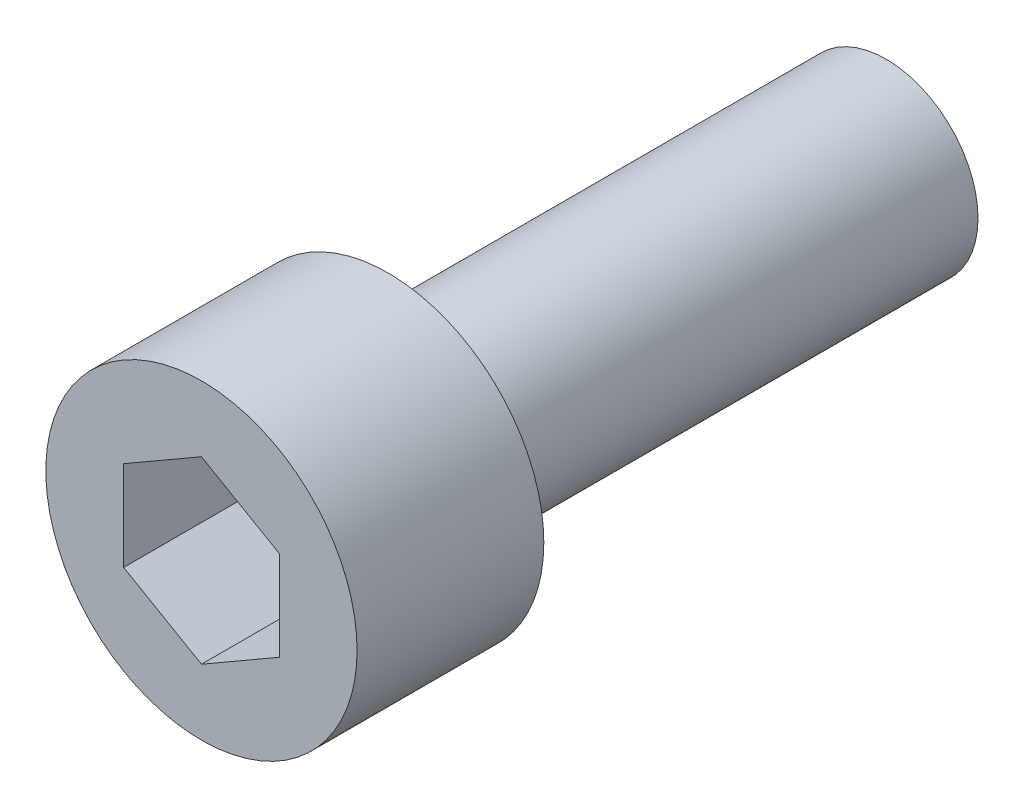
ISO-10303-21;
HEADER;
FILE_DESCRIPTION(('STEP AP214'),'2;1');
FILE_NAME('part.step','',(''),(''),'','','');
FILE_SCHEMA(('AUTOMOTIVE_DESIGN { 1 0 10303 214 1 1 1 1 }'));
ENDSEC;
DATA;
#1=APPLICATION_CONTEXT('core data for automotive mechanical design processes');
#2=APPLICATION_PROTOCOL_DEFINITION('international standard','automotive_design',2000,#1);
#3=PRODUCT_CONTEXT('',#1,'mechanical');
#4=PRODUCT('Part','Part','',(#3));
#5=PRODUCT_RELATED_PRODUCT_CATEGORY('part','',(#4));
#6=PRODUCT_DEFINITION_FORMATION('','',#4);
#7=PRODUCT_DEFINITION_CONTEXT('part definition',#1,'design');
#8=PRODUCT_DEFINITION('design','',#6,#7);
#9=PRODUCT_DEFINITION_SHAPE('','',#8);
#10=(LENGTH_UNIT() NAMED_UNIT(*) SI_UNIT(.MILLI.,.METRE.));
#11=(NAMED_UNIT(*) PLANE_ANGLE_UNIT() SI_UNIT($,.RADIAN.));
#12=(NAMED_UNIT(*) SI_UNIT($,.STERADIAN.) SOLID_ANGLE_UNIT());
#13=UNCERTAINTY_MEASURE_WITH_UNIT(LENGTH_MEASURE(1.E-05),#10,'distance_accuracy_value','');
#14=(GEOMETRIC_REPRESENTATION_CONTEXT(3) GLOBAL_UNCERTAINTY_ASSIGNED_CONTEXT((#13)) GLOBAL_UNIT_ASSIGNED_CONTEXT((#10,
#11,#12)) REPRESENTATION_CONTEXT('',''));
#15=CARTESIAN_POINT('',(0.,0.,0.));
#16=DIRECTION('',(0.,0.,1.));
#17=DIRECTION('',(1.,0.,0.));
#18=AXIS2_PLACEMENT_3D('',#15,#16,#17);
#19=CARTESIAN_POINT('',(0.,0.,-16.));
#20=DIRECTION('',(0.,0.,1.));
#21=DIRECTION('',(1.,0.,0.));
#22=AXIS2_PLACEMENT_3D('',#19,#20,#21);
#23=CYLINDRICAL_SURFACE('',#22,2.95);
#24=CARTESIAN_POINT('',(0.,0.,-16.));
#25=DIRECTION('',(0.,0.,1.));
#26=DIRECTION('',(1.,0.,0.));
#27=AXIS2_PLACEMENT_3D('',#24,#25,#26);
#28=CIRCLE('',#27,2.95);
#29=CARTESIAN_POINT('',(2.95,0.,-16.));
#30=VERTEX_POINT('',#29);
#31=EDGE_CURVE('E11',#30,#30,#28,.T.);
#32=ORIENTED_EDGE('',*,*,#31,.T.);
#33=EDGE_LOOP('',(#32));
#34=FACE_BOUND('',#33,.T.);
#35=CARTESIAN_POINT('',(0.,0.,0.));
#36=DIRECTION('',(0.,0.,1.));
#37=DIRECTION('',(1.,0.,0.));
#38=AXIS2_PLACEMENT_3D('',#35,#36,#37);
#39=CIRCLE('',#38,2.95);
#40=CARTESIAN_POINT('',(2.95,0.,0.));
#41=VERTEX_POINT('',#40);
#42=EDGE_CURVE('E44',#41,#41,#39,.T.);
#43=ORIENTED_EDGE('',*,*,#42,.F.);
#44=EDGE_LOOP('',(#43));
#45=FACE_BOUND('',#44,.T.);
#46=ADVANCED_FACE('F41',(#34,#45),#23,.T.);
#47=CARTESIAN_POINT('',(0.,0.,-16.));
#48=DIRECTION('',(0.,0.,1.));
#49=DIRECTION('',(1.,0.,0.));
#50=AXIS2_PLACEMENT_3D('',#47,#48,#49);
#51=PLANE('',#50);
#52=ORIENTED_EDGE('',*,*,#31,.F.);
#53=EDGE_LOOP('',(#52));
#54=FACE_BOUND('',#53,.T.);
#55=ADVANCED_FACE('F174',(#54),#51,.F.);
#56=CARTESIAN_POINT('',(0.,0.,6.));
#57=DIRECTION('',(0.,0.,-1.));
#58=DIRECTION('',(-1.,0.,0.));
#59=AXIS2_PLACEMENT_3D('',#56,#57,#58);
#60=CYLINDRICAL_SURFACE('',#59,5.);
#61=CARTESIAN_POINT('',(0.,0.,6.));
#62=DIRECTION('',(0.,0.,1.));
#63=DIRECTION('',(1.,0.,0.));
#64=AXIS2_PLACEMENT_3D('',#61,#62,#63);
#65=CIRCLE('',#64,5.);
#66=CARTESIAN_POINT('',(5.,0.,6.));
#67=VERTEX_POINT('',#66);
#68=EDGE_CURVE('E148',#67,#67,#65,.T.);
#69=ORIENTED_EDGE('',*,*,#68,.F.);
#70=EDGE_LOOP('',(#69));
#71=FACE_BOUND('',#70,.T.);
#72=CARTESIAN_POINT('',(0.,0.,0.));
#73=DIRECTION('',(0.,0.,1.));
#74=DIRECTION('',(1.,0.,0.));
#75=AXIS2_PLACEMENT_3D('',#72,#73,#74);
#76=CIRCLE('',#75,5.);
#77=CARTESIAN_POINT('',(5.,0.,0.));
#78=VERTEX_POINT('',#77);
#79=EDGE_CURVE('E142',#78,#78,#76,.T.);
#80=ORIENTED_EDGE('',*,*,#79,.T.);
#81=EDGE_LOOP('',(#80));
#82=FACE_BOUND('',#81,.T.);
#83=ADVANCED_FACE('F154',(#71,#82),#60,.T.);
#84=CARTESIAN_POINT('',(0.,0.,6.));
#85=DIRECTION('',(0.,0.,1.));
#86=DIRECTION('',(1.,0.,0.));
#87=AXIS2_PLACEMENT_3D('',#84,#85,#86);
#88=PLANE('',#87);
#89=DIRECTION('',(0.,1.,0.));
#90=VECTOR('',#89,1.);
#91=CARTESIAN_POINT('',(2.5,-1.44337567297406,6.));
#92=LINE('',#91,#90);
#93=CARTESIAN_POINT('',(2.5,-1.44337567297406,6.));
#94=VERTEX_POINT('',#93);
#95=CARTESIAN_POINT('',(2.5,1.44337567297406,6.));
#96=VERTEX_POINT('',#95);
#97=EDGE_CURVE('E55',#94,#96,#92,.T.);
#98=ORIENTED_EDGE('',*,*,#97,.F.);
#99=DIRECTION('',(0.866025403784438,0.5,0.));
#100=VECTOR('',#99,1.);
#101=CARTESIAN_POINT('',(0.,-2.88675134594813,6.));
#102=LINE('',#101,#100);
#103=CARTESIAN_POINT('',(0.,-2.88675134594813,6.));
#104=VERTEX_POINT('',#103);
#105=EDGE_CURVE('E138',#104,#94,#102,.T.);
#106=ORIENTED_EDGE('',*,*,#105,.F.);
#107=DIRECTION('',(0.866025403784438,-0.5,0.));
#108=VECTOR('',#107,1.);
#109=CARTESIAN_POINT('',(-2.5,-1.44337567297406,6.));
#110=LINE('',#109,#108);
#111=CARTESIAN_POINT('',(-2.5,-1.44337567297406,6.));
#112=VERTEX_POINT('',#111);
#113=EDGE_CURVE('E136',#112,#104,#110,.T.);
#114=ORIENTED_EDGE('',*,*,#113,.F.);
#115=DIRECTION('',(0.,-1.,0.));
#116=VECTOR('',#115,1.);
#117=CARTESIAN_POINT('',(-2.5,1.44337567297407,6.));
#118=LINE('',#117,#116);
#119=CARTESIAN_POINT('',(-2.5,1.44337567297407,6.));
#120=VERTEX_POINT('',#119);
#121=EDGE_CURVE('E103',#120,#112,#118,.T.);
#122=ORIENTED_EDGE('',*,*,#121,.F.);
#123=DIRECTION('',(-0.866025403784439,-0.5,0.));
#124=VECTOR('',#123,1.);
#125=CARTESIAN_POINT('',(0.,2.88675134594813,6.));
#126=LINE('',#125,#124);
#127=CARTESIAN_POINT('',(0.,2.88675134594813,6.));
#128=VERTEX_POINT('',#127);
#129=EDGE_CURVE('E132',#128,#120,#126,.T.);
#130=ORIENTED_EDGE('',*,*,#129,.F.);
#131=DIRECTION('',(-0.866025403784439,0.5,0.));
#132=VECTOR('',#131,1.);
#133=CARTESIAN_POINT('',(2.5,1.44337567297406,6.));
#134=LINE('',#133,#132);
#135=EDGE_CURVE('E129',#96,#128,#134,.T.);
#136=ORIENTED_EDGE('',*,*,#135,.F.);
#137=EDGE_LOOP('',(#98,#106,#114,#122,#130,#136));
#138=FACE_BOUND('',#137,.T.);
#139=ORIENTED_EDGE('',*,*,#68,.T.);
#140=EDGE_LOOP('',(#139));
#141=FACE_BOUND('',#140,.T.);
#142=ADVANCED_FACE('F159',(#138,#141),#88,.T.);
#143=CARTESIAN_POINT('',(0.,0.,0.));
#144=DIRECTION('',(0.,0.,1.));
#145=DIRECTION('',(1.,0.,0.));
#146=AXIS2_PLACEMENT_3D('',#143,#144,#145);
#147=PLANE('',#146);
#148=ORIENTED_EDGE('',*,*,#42,.T.);
#149=EDGE_LOOP('',(#148));
#150=FACE_BOUND('',#149,.T.);
#151=ORIENTED_EDGE('',*,*,#79,.F.);
#152=EDGE_LOOP('',(#151));
#153=FACE_BOUND('',#152,.T.);
#154=ADVANCED_FACE('F156',(#150,#153),#147,.F.);
#155=CARTESIAN_POINT('',(2.5,-1.44337567297406,2.1));
#156=DIRECTION('',(1.,0.,0.));
#157=DIRECTION('',(0.,1.,0.));
#158=AXIS2_PLACEMENT_3D('',#155,#156,#157);
#159=PLANE('',#158);
#160=ORIENTED_EDGE('',*,*,#97,.T.);
#161=DIRECTION('',(0.,0.,1.));
#162=VECTOR('',#161,1.);
#163=CARTESIAN_POINT('',(2.5,1.44337567297406,2.1));
#164=LINE('',#163,#162);
#165=CARTESIAN_POINT('',(2.5,1.44337567297406,2.1));
#166=VERTEX_POINT('',#165);
#167=EDGE_CURVE('E85',#166,#96,#164,.T.);
#168=ORIENTED_EDGE('',*,*,#167,.F.);
#169=DIRECTION('',(0.,1.,0.));
#170=VECTOR('',#169,1.);
#171=CARTESIAN_POINT('',(2.5,-1.44337567297406,2.1));
#172=LINE('',#171,#170);
#173=CARTESIAN_POINT('',(2.5,-1.44337567297406,2.1));
#174=VERTEX_POINT('',#173);
#175=EDGE_CURVE('E140',#174,#166,#172,.T.);
#176=ORIENTED_EDGE('',*,*,#175,.F.);
#177=DIRECTION('',(0.,0.,1.));
#178=VECTOR('',#177,1.);
#179=CARTESIAN_POINT('',(2.5,-1.44337567297406,2.1));
#180=LINE('',#179,#178);
#181=EDGE_CURVE('E63',#174,#94,#180,.T.);
#182=ORIENTED_EDGE('',*,*,#181,.T.);
#183=EDGE_LOOP('',(#160,#168,#176,#182));
#184=FACE_BOUND('',#183,.T.);
#185=ADVANCED_FACE('F158',(#184),#159,.F.);
#186=CARTESIAN_POINT('',(0.,-2.88675134594813,2.1));
#187=DIRECTION('',(0.5,-0.866025403784438,0.));
#188=DIRECTION('',(0.866025403784439,0.5,0.));
#189=AXIS2_PLACEMENT_3D('',#186,#187,#188);
#190=PLANE('',#189);
#191=ORIENTED_EDGE('',*,*,#105,.T.);
#192=ORIENTED_EDGE('',*,*,#181,.F.);
#193=DIRECTION('',(0.866025403784438,0.5,0.));
#194=VECTOR('',#193,1.);
#195=CARTESIAN_POINT('',(0.,-2.88675134594813,2.1));
#196=LINE('',#195,#194);
#197=CARTESIAN_POINT('',(0.,-2.88675134594813,2.1));
#198=VERTEX_POINT('',#197);
#199=EDGE_CURVE('E115',#198,#174,#196,.T.);
#200=ORIENTED_EDGE('',*,*,#199,.F.);
#201=DIRECTION('',(0.,0.,1.));
#202=VECTOR('',#201,1.);
#203=CARTESIAN_POINT('',(0.,-2.88675134594813,2.1));
#204=LINE('',#203,#202);
#205=EDGE_CURVE('E107',#198,#104,#204,.T.);
#206=ORIENTED_EDGE('',*,*,#205,.T.);
#207=EDGE_LOOP('',(#191,#192,#200,#206));
#208=FACE_BOUND('',#207,.T.);
#209=ADVANCED_FACE('F167',(#208),#190,.F.);
#210=CARTESIAN_POINT('',(-2.5,-1.44337567297406,2.1));
#211=DIRECTION('',(-0.5,-0.866025403784438,0.));
#212=DIRECTION('',(0.866025403784439,-0.5,0.));
#213=AXIS2_PLACEMENT_3D('',#210,#211,#212);
#214=PLANE('',#213);
#215=ORIENTED_EDGE('',*,*,#113,.T.);
#216=ORIENTED_EDGE('',*,*,#205,.F.);
#217=DIRECTION('',(0.866025403784438,-0.5,0.));
#218=VECTOR('',#217,1.);
#219=CARTESIAN_POINT('',(-2.5,-1.44337567297406,2.1));
#220=LINE('',#219,#218);
#221=CARTESIAN_POINT('',(-2.5,-1.44337567297406,2.1));
#222=VERTEX_POINT('',#221);
#223=EDGE_CURVE('E111',#222,#198,#220,.T.);
#224=ORIENTED_EDGE('',*,*,#223,.F.);
#225=DIRECTION('',(0.,0.,1.));
#226=VECTOR('',#225,1.);
#227=CARTESIAN_POINT('',(-2.5,-1.44337567297406,2.1));
#228=LINE('',#227,#226);
#229=EDGE_CURVE('E96',#222,#112,#228,.T.);
#230=ORIENTED_EDGE('',*,*,#229,.T.);
#231=EDGE_LOOP('',(#215,#216,#224,#230));
#232=FACE_BOUND('',#231,.T.);
#233=ADVANCED_FACE('F112',(#232),#214,.F.);
#234=CARTESIAN_POINT('',(-2.5,1.44337567297407,2.1));
#235=DIRECTION('',(-1.,0.,0.));
#236=DIRECTION('',(0.,-1.,0.));
#237=AXIS2_PLACEMENT_3D('',#234,#235,#236);
#238=PLANE('',#237);
#239=ORIENTED_EDGE('',*,*,#121,.T.);
#240=ORIENTED_EDGE('',*,*,#229,.F.);
#241=DIRECTION('',(0.,-1.,0.));
#242=VECTOR('',#241,1.);
#243=CARTESIAN_POINT('',(-2.5,1.44337567297407,2.1));
#244=LINE('',#243,#242);
#245=CARTESIAN_POINT('',(-2.5,1.44337567297407,2.1));
#246=VERTEX_POINT('',#245);
#247=EDGE_CURVE('E100',#246,#222,#244,.T.);
#248=ORIENTED_EDGE('',*,*,#247,.F.);
#249=DIRECTION('',(0.,0.,1.));
#250=VECTOR('',#249,1.);
#251=CARTESIAN_POINT('',(-2.5,1.44337567297407,2.1));
#252=LINE('',#251,#250);
#253=EDGE_CURVE('E108',#246,#120,#252,.T.);
#254=ORIENTED_EDGE('',*,*,#253,.T.);
#255=EDGE_LOOP('',(#239,#240,#248,#254));
#256=FACE_BOUND('',#255,.T.);
#257=ADVANCED_FACE('F98',(#256),#238,.F.);
#258=CARTESIAN_POINT('',(0.,2.88675134594813,2.1));
#259=DIRECTION('',(-0.5,0.866025403784439,0.));
#260=DIRECTION('',(-0.866025403784439,-0.5,0.));
#261=AXIS2_PLACEMENT_3D('',#258,#259,#260);
#262=PLANE('',#261);
#263=ORIENTED_EDGE('',*,*,#129,.T.);
#264=ORIENTED_EDGE('',*,*,#253,.F.);
#265=DIRECTION('',(-0.866025403784439,-0.5,0.));
#266=VECTOR('',#265,1.);
#267=CARTESIAN_POINT('',(0.,2.88675134594813,2.1));
#268=LINE('',#267,#266);
#269=CARTESIAN_POINT('',(0.,2.88675134594813,2.1));
#270=VERTEX_POINT('',#269);
#271=EDGE_CURVE('E121',#270,#246,#268,.T.);
#272=ORIENTED_EDGE('',*,*,#271,.F.);
#273=DIRECTION('',(0.,0.,1.));
#274=VECTOR('',#273,1.);
#275=CARTESIAN_POINT('',(0.,2.88675134594813,2.1));
#276=LINE('',#275,#274);
#277=EDGE_CURVE('E145',#270,#128,#276,.T.);
#278=ORIENTED_EDGE('',*,*,#277,.T.);
#279=EDGE_LOOP('',(#263,#264,#272,#278));
#280=FACE_BOUND('',#279,.T.);
#281=ADVANCED_FACE('F235',(#280),#262,.F.);
#282=CARTESIAN_POINT('',(2.5,1.44337567297406,2.1));
#283=DIRECTION('',(0.5,0.866025403784439,0.));
#284=DIRECTION('',(-0.866025403784439,0.5,0.));
#285=AXIS2_PLACEMENT_3D('',#282,#283,#284);
#286=PLANE('',#285);
#287=ORIENTED_EDGE('',*,*,#135,.T.);
#288=ORIENTED_EDGE('',*,*,#277,.F.);
#289=DIRECTION('',(-0.866025403784439,0.5,0.));
#290=VECTOR('',#289,1.);
#291=CARTESIAN_POINT('',(2.5,1.44337567297406,2.1));
#292=LINE('',#291,#290);
#293=EDGE_CURVE('E123',#166,#270,#292,.T.);
#294=ORIENTED_EDGE('',*,*,#293,.F.);
#295=ORIENTED_EDGE('',*,*,#167,.T.);
#296=EDGE_LOOP('',(#287,#288,#294,#295));
#297=FACE_BOUND('',#296,.T.);
#298=ADVANCED_FACE('F244',(#297),#286,.F.);
#299=CARTESIAN_POINT('',(0.,0.,2.1));
#300=DIRECTION('',(0.,0.,1.));
#301=DIRECTION('',(1.,0.,0.));
#302=AXIS2_PLACEMENT_3D('',#299,#300,#301);
#303=PLANE('',#302);
#304=ORIENTED_EDGE('',*,*,#175,.T.);
#305=ORIENTED_EDGE('',*,*,#293,.T.);
#306=ORIENTED_EDGE('',*,*,#271,.T.);
#307=ORIENTED_EDGE('',*,*,#247,.T.);
#308=ORIENTED_EDGE('',*,*,#223,.T.);
#309=ORIENTED_EDGE('',*,*,#199,.T.);
#310=EDGE_LOOP('',(#304,#305,#306,#307,#308,#309));
#311=FACE_BOUND('',#310,.T.);
#312=ADVANCED_FACE('F118',(#311),#303,.T.);
#313=CLOSED_SHELL('',(#46,#55,#83,#142,#154,#185,#209,#233,#257,#281,#298,#312));
#314=MANIFOLD_SOLID_BREP('B2',#313);
#315=ADVANCED_BREP_SHAPE_REPRESENTATION('',(#18,#314),#14);
#316=SHAPE_DEFINITION_REPRESENTATION(#9,#315);
ENDSEC;
END-ISO-10303-21;
